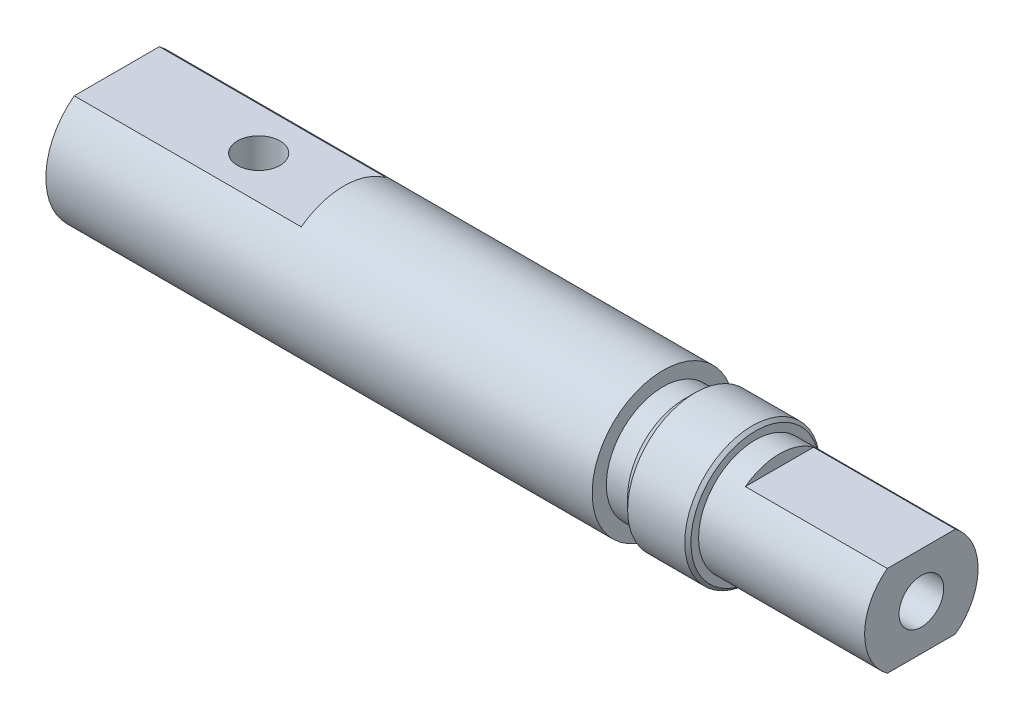
ISO-10303-21;
HEADER;
FILE_DESCRIPTION(('STEP AP214'),'2;1');
FILE_NAME('part.step','',(''),(''),'','','');
FILE_SCHEMA(('AUTOMOTIVE_DESIGN { 1 0 10303 214 1 1 1 1 }'));
ENDSEC;
DATA;
#1=APPLICATION_CONTEXT('core data for automotive mechanical design processes');
#2=APPLICATION_PROTOCOL_DEFINITION('international standard','automotive_design',2000,#1);
#3=PRODUCT_CONTEXT('',#1,'mechanical');
#4=PRODUCT('Part','Part','',(#3));
#5=PRODUCT_RELATED_PRODUCT_CATEGORY('part','',(#4));
#6=PRODUCT_DEFINITION_FORMATION('','',#4);
#7=PRODUCT_DEFINITION_CONTEXT('part definition',#1,'design');
#8=PRODUCT_DEFINITION('design','',#6,#7);
#9=PRODUCT_DEFINITION_SHAPE('','',#8);
#10=(LENGTH_UNIT() NAMED_UNIT(*) SI_UNIT(.MILLI.,.METRE.));
#11=(NAMED_UNIT(*) PLANE_ANGLE_UNIT() SI_UNIT($,.RADIAN.));
#12=(NAMED_UNIT(*) SI_UNIT($,.STERADIAN.) SOLID_ANGLE_UNIT());
#13=UNCERTAINTY_MEASURE_WITH_UNIT(LENGTH_MEASURE(1.E-05),#10,'distance_accuracy_value','');
#14=(GEOMETRIC_REPRESENTATION_CONTEXT(3) GLOBAL_UNCERTAINTY_ASSIGNED_CONTEXT((#13)) GLOBAL_UNIT_ASSIGNED_CONTEXT((#10,
#11,#12)) REPRESENTATION_CONTEXT('',''));
#15=CARTESIAN_POINT('',(0.,0.,0.));
#16=DIRECTION('',(0.,0.,1.));
#17=DIRECTION('',(1.,0.,0.));
#18=AXIS2_PLACEMENT_3D('',#15,#16,#17);
#19=CARTESIAN_POINT('',(45.,0.,0.));
#20=DIRECTION('',(-1.,0.,0.));
#21=DIRECTION('',(0.,0.,1.));
#22=AXIS2_PLACEMENT_3D('',#19,#20,#21);
#23=CYLINDRICAL_SURFACE('',#22,4.7565);
#24=CARTESIAN_POINT('',(44.7835,0.,0.));
#25=DIRECTION('',(-1.,0.,0.));
#26=DIRECTION('',(0.,0.,1.));
#27=AXIS2_PLACEMENT_3D('',#24,#25,#26);
#28=CIRCLE('',#27,4.7565);
#29=CARTESIAN_POINT('',(44.7835,0.,4.7565));
#30=VERTEX_POINT('',#29);
#31=EDGE_CURVE('E496',#30,#30,#28,.T.);
#32=ORIENTED_EDGE('',*,*,#31,.T.);
#33=EDGE_LOOP('',(#32));
#34=FACE_BOUND('',#33,.T.);
#35=CARTESIAN_POINT('',(40.7565,0.,0.));
#36=DIRECTION('',(1.,0.,0.));
#37=DIRECTION('',(0.,0.,-1.));
#38=AXIS2_PLACEMENT_3D('',#35,#36,#37);
#39=CIRCLE('',#38,4.7565);
#40=CARTESIAN_POINT('',(40.7565,0.,-4.7565));
#41=VERTEX_POINT('',#40);
#42=EDGE_CURVE('E494',#41,#41,#39,.F.);
#43=ORIENTED_EDGE('',*,*,#42,.F.);
#44=EDGE_LOOP('',(#43));
#45=FACE_BOUND('',#44,.T.);
#46=ADVANCED_FACE('F55',(#34,#45),#23,.T.);
#47=CARTESIAN_POINT('',(45.,0.,0.));
#48=DIRECTION('',(-1.,0.,0.));
#49=DIRECTION('',(0.,0.,1.));
#50=AXIS2_PLACEMENT_3D('',#47,#48,#49);
#51=CONICAL_SURFACE('',#50,4.54,0.78539816339745);
#52=ORIENTED_EDGE('',*,*,#31,.F.);
#53=EDGE_LOOP('',(#52));
#54=FACE_BOUND('',#53,.T.);
#55=CARTESIAN_POINT('',(45.,0.,0.));
#56=DIRECTION('',(-1.,0.,0.));
#57=DIRECTION('',(0.,0.,1.));
#58=AXIS2_PLACEMENT_3D('',#55,#56,#57);
#59=CIRCLE('',#58,4.54);
#60=CARTESIAN_POINT('',(45.,0.,4.54));
#61=VERTEX_POINT('',#60);
#62=EDGE_CURVE('E162',#61,#61,#59,.T.);
#63=ORIENTED_EDGE('',*,*,#62,.T.);
#64=EDGE_LOOP('',(#63));
#65=FACE_BOUND('',#64,.T.);
#66=ADVANCED_FACE('F275',(#54,#65),#51,.T.);
#67=CARTESIAN_POINT('',(46.7,0.,0.));
#68=DIRECTION('',(1.,0.,0.));
#69=DIRECTION('',(0.,0.,-1.));
#70=AXIS2_PLACEMENT_3D('',#67,#68,#69);
#71=CONICAL_SURFACE('',#70,1.575,1.02974425867665);
#72=CARTESIAN_POINT('',(45.7536445250316,0.,0.));
#73=VERTEX_POINT('',#72);
#74=VERTEX_LOOP('',#73);
#75=FACE_BOUND('',#74,.T.);
#76=CARTESIAN_POINT('',(46.7,0.,0.));
#77=DIRECTION('',(1.,0.,0.));
#78=DIRECTION('',(0.,0.,-1.));
#79=AXIS2_PLACEMENT_3D('',#76,#77,#78);
#80=CIRCLE('',#79,1.575);
#81=CARTESIAN_POINT('',(46.7,0.,-1.575));
#82=VERTEX_POINT('',#81);
#83=EDGE_CURVE('E170',#82,#82,#80,.T.);
#84=ORIENTED_EDGE('',*,*,#83,.T.);
#85=EDGE_LOOP('',(#84));
#86=FACE_BOUND('',#85,.T.);
#87=ADVANCED_FACE('F282',(#75,#86),#71,.F.);
#88=CARTESIAN_POINT('',(56.7,0.,0.));
#89=DIRECTION('',(1.,0.,0.));
#90=DIRECTION('',(0.,0.,-1.));
#91=AXIS2_PLACEMENT_3D('',#88,#89,#90);
#92=CYLINDRICAL_SURFACE('',#91,1.575);
#93=ORIENTED_EDGE('',*,*,#83,.F.);
#94=EDGE_LOOP('',(#93));
#95=FACE_BOUND('',#94,.T.);
#96=CARTESIAN_POINT('',(56.7,0.,0.));
#97=DIRECTION('',(1.,0.,0.));
#98=DIRECTION('',(0.,0.,-1.));
#99=AXIS2_PLACEMENT_3D('',#96,#97,#98);
#100=CIRCLE('',#99,1.575);
#101=CARTESIAN_POINT('',(56.7,0.,-1.575));
#102=VERTEX_POINT('',#101);
#103=EDGE_CURVE('E147',#102,#102,#100,.T.);
#104=ORIENTED_EDGE('',*,*,#103,.T.);
#105=EDGE_LOOP('',(#104));
#106=FACE_BOUND('',#105,.T.);
#107=ADVANCED_FACE('F299',(#95,#106),#92,.F.);
#108=CARTESIAN_POINT('',(46.7,0.,0.));
#109=DIRECTION('',(1.,0.,0.));
#110=DIRECTION('',(0.,0.,-1.));
#111=AXIS2_PLACEMENT_3D('',#108,#109,#110);
#112=PLANE('',#111);
#113=DIRECTION('',(0.,0.,-1.));
#114=VECTOR('',#113,1.);
#115=CARTESIAN_POINT('',(46.7,-3.2,0.));
#116=LINE('',#115,#114);
#117=CARTESIAN_POINT('',(46.7,-3.2,2.4));
#118=VERTEX_POINT('',#117);
#119=CARTESIAN_POINT('',(46.7,-3.2,-2.4));
#120=VERTEX_POINT('',#119);
#121=EDGE_CURVE('E151',#118,#120,#116,.T.);
#122=ORIENTED_EDGE('',*,*,#121,.F.);
#123=CARTESIAN_POINT('',(46.7,0.,0.));
#124=DIRECTION('',(1.,0.,0.));
#125=DIRECTION('',(0.,0.,-1.));
#126=AXIS2_PLACEMENT_3D('',#123,#124,#125);
#127=CIRCLE('',#126,4.);
#128=EDGE_CURVE('E154',#118,#120,#127,.T.);
#129=ORIENTED_EDGE('',*,*,#128,.T.);
#130=EDGE_LOOP('',(#122,#129));
#131=FACE_BOUND('',#130,.T.);
#132=ADVANCED_FACE('F296',(#131),#112,.T.);
#133=CARTESIAN_POINT('',(46.7,-3.2,0.));
#134=DIRECTION('',(0.,-1.,0.));
#135=DIRECTION('',(0.,0.,-1.));
#136=AXIS2_PLACEMENT_3D('',#133,#134,#135);
#137=PLANE('',#136);
#138=DIRECTION('',(0.,0.,-1.));
#139=VECTOR('',#138,1.);
#140=CARTESIAN_POINT('',(56.7,-3.2,0.));
#141=LINE('',#140,#139);
#142=CARTESIAN_POINT('',(56.7,-3.2,2.4));
#143=VERTEX_POINT('',#142);
#144=CARTESIAN_POINT('',(56.7,-3.2,-2.4));
#145=VERTEX_POINT('',#144);
#146=EDGE_CURVE('E155',#143,#145,#141,.T.);
#147=ORIENTED_EDGE('',*,*,#146,.F.);
#148=DIRECTION('',(1.,0.,0.));
#149=VECTOR('',#148,1.);
#150=CARTESIAN_POINT('',(46.7,-3.2,2.4));
#151=LINE('',#150,#149);
#152=EDGE_CURVE('E159',#118,#143,#151,.T.);
#153=ORIENTED_EDGE('',*,*,#152,.F.);
#154=ORIENTED_EDGE('',*,*,#121,.T.);
#155=DIRECTION('',(1.,0.,0.));
#156=VECTOR('',#155,1.);
#157=CARTESIAN_POINT('',(46.7,-3.2,-2.4));
#158=LINE('',#157,#156);
#159=EDGE_CURVE('E72',#120,#145,#158,.T.);
#160=ORIENTED_EDGE('',*,*,#159,.T.);
#161=EDGE_LOOP('',(#147,#153,#154,#160));
#162=FACE_BOUND('',#161,.T.);
#163=ADVANCED_FACE('F292',(#162),#137,.T.);
#164=CARTESIAN_POINT('',(46.7,0.,0.));
#165=DIRECTION('',(1.,0.,0.));
#166=DIRECTION('',(0.,0.,-1.));
#167=AXIS2_PLACEMENT_3D('',#164,#165,#166);
#168=PLANE('',#167);
#169=CARTESIAN_POINT('',(46.7,0.,0.));
#170=DIRECTION('',(1.,0.,0.));
#171=DIRECTION('',(0.,0.,-1.));
#172=AXIS2_PLACEMENT_3D('',#169,#170,#171);
#173=CIRCLE('',#172,4.);
#174=CARTESIAN_POINT('',(46.7,3.2,-2.4));
#175=VERTEX_POINT('',#174);
#176=CARTESIAN_POINT('',(46.7,3.2,2.4));
#177=VERTEX_POINT('',#176);
#178=EDGE_CURVE('E126',#175,#177,#173,.T.);
#179=ORIENTED_EDGE('',*,*,#178,.T.);
#180=DIRECTION('',(0.,0.,-1.));
#181=VECTOR('',#180,1.);
#182=CARTESIAN_POINT('',(46.7,3.2,0.));
#183=LINE('',#182,#181);
#184=EDGE_CURVE('E128',#177,#175,#183,.T.);
#185=ORIENTED_EDGE('',*,*,#184,.T.);
#186=EDGE_LOOP('',(#179,#185));
#187=FACE_BOUND('',#186,.T.);
#188=ADVANCED_FACE('F127',(#187),#168,.T.);
#189=CARTESIAN_POINT('',(46.7,3.2,0.));
#190=DIRECTION('',(0.,-1.,0.));
#191=DIRECTION('',(0.,0.,-1.));
#192=AXIS2_PLACEMENT_3D('',#189,#190,#191);
#193=PLANE('',#192);
#194=DIRECTION('',(0.,0.,-1.));
#195=VECTOR('',#194,1.);
#196=CARTESIAN_POINT('',(56.7,3.2,0.));
#197=LINE('',#196,#195);
#198=CARTESIAN_POINT('',(56.7,3.2,2.4));
#199=VERTEX_POINT('',#198);
#200=CARTESIAN_POINT('',(56.7,3.2,-2.4));
#201=VERTEX_POINT('',#200);
#202=EDGE_CURVE('E132',#199,#201,#197,.T.);
#203=ORIENTED_EDGE('',*,*,#202,.T.);
#204=DIRECTION('',(1.,0.,0.));
#205=VECTOR('',#204,1.);
#206=CARTESIAN_POINT('',(46.7,3.2,-2.4));
#207=LINE('',#206,#205);
#208=EDGE_CURVE('E135',#175,#201,#207,.T.);
#209=ORIENTED_EDGE('',*,*,#208,.F.);
#210=ORIENTED_EDGE('',*,*,#184,.F.);
#211=DIRECTION('',(1.,0.,0.));
#212=VECTOR('',#211,1.);
#213=CARTESIAN_POINT('',(46.7,3.2,2.4));
#214=LINE('',#213,#212);
#215=EDGE_CURVE('E80',#177,#199,#214,.T.);
#216=ORIENTED_EDGE('',*,*,#215,.T.);
#217=EDGE_LOOP('',(#203,#209,#210,#216));
#218=FACE_BOUND('',#217,.T.);
#219=ADVANCED_FACE('F134',(#218),#193,.F.);
#220=CARTESIAN_POINT('',(56.7,0.,0.));
#221=DIRECTION('',(1.,0.,0.));
#222=DIRECTION('',(0.,0.,-1.));
#223=AXIS2_PLACEMENT_3D('',#220,#221,#222);
#224=PLANE('',#223);
#225=ORIENTED_EDGE('',*,*,#202,.F.);
#226=CARTESIAN_POINT('',(56.7,0.,0.));
#227=DIRECTION('',(1.,0.,0.));
#228=DIRECTION('',(0.,0.,-1.));
#229=AXIS2_PLACEMENT_3D('',#226,#227,#228);
#230=CIRCLE('',#229,4.);
#231=EDGE_CURVE('E143',#199,#143,#230,.T.);
#232=ORIENTED_EDGE('',*,*,#231,.T.);
#233=ORIENTED_EDGE('',*,*,#146,.T.);
#234=EDGE_CURVE('E174',#145,#201,#230,.T.);
#235=ORIENTED_EDGE('',*,*,#234,.T.);
#236=EDGE_LOOP('',(#225,#232,#233,#235));
#237=FACE_BOUND('',#236,.T.);
#238=ORIENTED_EDGE('',*,*,#103,.F.);
#239=EDGE_LOOP('',(#238));
#240=FACE_BOUND('',#239,.T.);
#241=ADVANCED_FACE('F295',(#237,#240),#224,.T.);
#242=CARTESIAN_POINT('',(0.,0.,0.));
#243=DIRECTION('',(-1.,0.,0.));
#244=DIRECTION('',(0.,0.,1.));
#245=AXIS2_PLACEMENT_3D('',#242,#243,#244);
#246=CYLINDRICAL_SURFACE('',#245,4.);
#247=ORIENTED_EDGE('',*,*,#231,.F.);
#248=ORIENTED_EDGE('',*,*,#215,.F.);
#249=ORIENTED_EDGE('',*,*,#178,.F.);
#250=ORIENTED_EDGE('',*,*,#208,.T.);
#251=ORIENTED_EDGE('',*,*,#234,.F.);
#252=ORIENTED_EDGE('',*,*,#159,.F.);
#253=ORIENTED_EDGE('',*,*,#128,.F.);
#254=ORIENTED_EDGE('',*,*,#152,.T.);
#255=EDGE_LOOP('',(#247,#248,#249,#250,#251,#252,#253,#254));
#256=FACE_BOUND('',#255,.T.);
#257=CARTESIAN_POINT('',(45.,0.,0.));
#258=DIRECTION('',(-1.,0.,0.));
#259=DIRECTION('',(0.,0.,1.));
#260=AXIS2_PLACEMENT_3D('',#257,#258,#259);
#261=CIRCLE('',#260,4.);
#262=CARTESIAN_POINT('',(45.,0.,4.));
#263=VERTEX_POINT('',#262);
#264=EDGE_CURVE('E215',#263,#263,#261,.T.);
#265=ORIENTED_EDGE('',*,*,#264,.F.);
#266=EDGE_LOOP('',(#265));
#267=FACE_BOUND('',#266,.T.);
#268=ADVANCED_FACE('F139',(#256,#267),#246,.T.);
#269=CARTESIAN_POINT('',(45.,0.,0.));
#270=DIRECTION('',(1.,0.,0.));
#271=DIRECTION('',(0.,0.,-1.));
#272=AXIS2_PLACEMENT_3D('',#269,#270,#271);
#273=PLANE('',#272);
#274=ORIENTED_EDGE('',*,*,#264,.T.);
#275=EDGE_LOOP('',(#274));
#276=FACE_BOUND('',#275,.T.);
#277=ORIENTED_EDGE('',*,*,#62,.F.);
#278=EDGE_LOOP('',(#277));
#279=FACE_BOUND('',#278,.T.);
#280=ADVANCED_FACE('F270',(#276,#279),#273,.T.);
#281=CARTESIAN_POINT('',(10.,4.,0.));
#282=DIRECTION('',(0.,1.,0.));
#283=DIRECTION('',(0.,0.,1.));
#284=AXIS2_PLACEMENT_3D('',#281,#282,#283);
#285=CYLINDRICAL_SURFACE('',#284,1.5);
#286=CARTESIAN_POINT('',(10.,-4.,0.));
#287=DIRECTION('',(0.,-1.,0.));
#288=DIRECTION('',(0.,0.,-1.));
#289=AXIS2_PLACEMENT_3D('',#286,#287,#288);
#290=CIRCLE('',#289,1.5);
#291=CARTESIAN_POINT('',(10.,-4.,-1.5));
#292=VERTEX_POINT('',#291);
#293=EDGE_CURVE('E194',#292,#292,#290,.T.);
#294=ORIENTED_EDGE('',*,*,#293,.T.);
#295=EDGE_LOOP('',(#294));
#296=FACE_BOUND('',#295,.T.);
#297=CARTESIAN_POINT('',(10.,4.,0.));
#298=DIRECTION('',(0.,1.,0.));
#299=DIRECTION('',(0.,0.,1.));
#300=AXIS2_PLACEMENT_3D('',#297,#298,#299);
#301=CIRCLE('',#300,1.5);
#302=CARTESIAN_POINT('',(10.,4.,1.5));
#303=VERTEX_POINT('',#302);
#304=EDGE_CURVE('E190',#303,#303,#301,.T.);
#305=ORIENTED_EDGE('',*,*,#304,.T.);
#306=EDGE_LOOP('',(#305));
#307=FACE_BOUND('',#306,.T.);
#308=ADVANCED_FACE('F260',(#296,#307),#285,.F.);
#309=CARTESIAN_POINT('',(16.,0.,0.));
#310=DIRECTION('',(-1.,0.,0.));
#311=DIRECTION('',(0.,0.,1.));
#312=AXIS2_PLACEMENT_3D('',#309,#310,#311);
#313=PLANE('',#312);
#314=DIRECTION('',(0.,0.,1.));
#315=VECTOR('',#314,1.);
#316=CARTESIAN_POINT('',(16.,-4.,0.));
#317=LINE('',#316,#315);
#318=CARTESIAN_POINT('',(16.,-4.,-3.));
#319=VERTEX_POINT('',#318);
#320=CARTESIAN_POINT('',(16.,-4.,3.));
#321=VERTEX_POINT('',#320);
#322=EDGE_CURVE('E219',#319,#321,#317,.T.);
#323=ORIENTED_EDGE('',*,*,#322,.F.);
#324=CARTESIAN_POINT('',(16.,0.,0.));
#325=DIRECTION('',(-1.,0.,0.));
#326=DIRECTION('',(0.,0.,1.));
#327=AXIS2_PLACEMENT_3D('',#324,#325,#326);
#328=CIRCLE('',#327,5.);
#329=EDGE_CURVE('E222',#319,#321,#328,.T.);
#330=ORIENTED_EDGE('',*,*,#329,.T.);
#331=EDGE_LOOP('',(#323,#330));
#332=FACE_BOUND('',#331,.T.);
#333=ADVANCED_FACE('F258',(#332),#313,.T.);
#334=CARTESIAN_POINT('',(16.,-4.,0.));
#335=DIRECTION('',(0.,-1.,0.));
#336=DIRECTION('',(0.,0.,-1.));
#337=AXIS2_PLACEMENT_3D('',#334,#335,#336);
#338=PLANE('',#337);
#339=ORIENTED_EDGE('',*,*,#293,.F.);
#340=EDGE_LOOP('',(#339));
#341=FACE_BOUND('',#340,.T.);
#342=DIRECTION('',(0.,0.,1.));
#343=VECTOR('',#342,1.);
#344=CARTESIAN_POINT('',(0.,-4.,0.));
#345=LINE('',#344,#343);
#346=CARTESIAN_POINT('',(0.,-4.,-3.));
#347=VERTEX_POINT('',#346);
#348=CARTESIAN_POINT('',(0.,-4.,3.));
#349=VERTEX_POINT('',#348);
#350=EDGE_CURVE('E198',#347,#349,#345,.T.);
#351=ORIENTED_EDGE('',*,*,#350,.F.);
#352=DIRECTION('',(-1.,0.,0.));
#353=VECTOR('',#352,1.);
#354=CARTESIAN_POINT('',(16.,-4.,-3.));
#355=LINE('',#354,#353);
#356=EDGE_CURVE('E226',#319,#347,#355,.T.);
#357=ORIENTED_EDGE('',*,*,#356,.F.);
#358=ORIENTED_EDGE('',*,*,#322,.T.);
#359=DIRECTION('',(-1.,0.,0.));
#360=VECTOR('',#359,1.);
#361=CARTESIAN_POINT('',(16.,-4.,3.));
#362=LINE('',#361,#360);
#363=EDGE_CURVE('E211',#321,#349,#362,.T.);
#364=ORIENTED_EDGE('',*,*,#363,.T.);
#365=EDGE_LOOP('',(#351,#357,#358,#364));
#366=FACE_BOUND('',#365,.T.);
#367=ADVANCED_FACE('F256',(#341,#366),#338,.T.);
#368=CARTESIAN_POINT('',(0.,0.,0.));
#369=DIRECTION('',(1.,0.,0.));
#370=DIRECTION('',(0.,0.,-1.));
#371=AXIS2_PLACEMENT_3D('',#368,#369,#370);
#372=PLANE('',#371);
#373=DIRECTION('',(0.,0.,-1.));
#374=VECTOR('',#373,1.);
#375=CARTESIAN_POINT('',(0.,4.,0.));
#376=LINE('',#375,#374);
#377=CARTESIAN_POINT('',(0.,4.,3.));
#378=VERTEX_POINT('',#377);
#379=CARTESIAN_POINT('',(0.,4.,-3.));
#380=VERTEX_POINT('',#379);
#381=EDGE_CURVE('E203',#378,#380,#376,.T.);
#382=ORIENTED_EDGE('',*,*,#381,.T.);
#383=CARTESIAN_POINT('',(0.,0.,0.));
#384=DIRECTION('',(-1.,0.,0.));
#385=DIRECTION('',(0.,0.,1.));
#386=AXIS2_PLACEMENT_3D('',#383,#384,#385);
#387=CIRCLE('',#386,5.);
#388=EDGE_CURVE('E11',#380,#347,#387,.T.);
#389=ORIENTED_EDGE('',*,*,#388,.T.);
#390=ORIENTED_EDGE('',*,*,#350,.T.);
#391=EDGE_CURVE('E60',#349,#378,#387,.T.);
#392=ORIENTED_EDGE('',*,*,#391,.T.);
#393=EDGE_LOOP('',(#382,#389,#390,#392));
#394=FACE_BOUND('',#393,.T.);
#395=ADVANCED_FACE('F242',(#394),#372,.F.);
#396=CARTESIAN_POINT('',(16.,0.,0.));
#397=DIRECTION('',(-1.,0.,0.));
#398=DIRECTION('',(0.,0.,1.));
#399=AXIS2_PLACEMENT_3D('',#396,#397,#398);
#400=PLANE('',#399);
#401=DIRECTION('',(0.,0.,-1.));
#402=VECTOR('',#401,1.);
#403=CARTESIAN_POINT('',(16.,4.,0.));
#404=LINE('',#403,#402);
#405=CARTESIAN_POINT('',(16.,4.,3.));
#406=VERTEX_POINT('',#405);
#407=CARTESIAN_POINT('',(16.,4.,-3.));
#408=VERTEX_POINT('',#407);
#409=EDGE_CURVE('E199',#406,#408,#404,.T.);
#410=ORIENTED_EDGE('',*,*,#409,.F.);
#411=CARTESIAN_POINT('',(16.,0.,0.));
#412=DIRECTION('',(-1.,0.,0.));
#413=DIRECTION('',(0.,0.,1.));
#414=AXIS2_PLACEMENT_3D('',#411,#412,#413);
#415=CIRCLE('',#414,5.);
#416=EDGE_CURVE('E202',#406,#408,#415,.T.);
#417=ORIENTED_EDGE('',*,*,#416,.T.);
#418=EDGE_LOOP('',(#410,#417));
#419=FACE_BOUND('',#418,.T.);
#420=ADVANCED_FACE('F320',(#419),#400,.T.);
#421=CARTESIAN_POINT('',(16.,4.,0.));
#422=DIRECTION('',(0.,1.,0.));
#423=DIRECTION('',(0.,0.,1.));
#424=AXIS2_PLACEMENT_3D('',#421,#422,#423);
#425=PLANE('',#424);
#426=ORIENTED_EDGE('',*,*,#304,.F.);
#427=EDGE_LOOP('',(#426));
#428=FACE_BOUND('',#427,.T.);
#429=ORIENTED_EDGE('',*,*,#381,.F.);
#430=DIRECTION('',(-1.,0.,0.));
#431=VECTOR('',#430,1.);
#432=CARTESIAN_POINT('',(16.,4.,3.));
#433=LINE('',#432,#431);
#434=EDGE_CURVE('E207',#406,#378,#433,.T.);
#435=ORIENTED_EDGE('',*,*,#434,.F.);
#436=ORIENTED_EDGE('',*,*,#409,.T.);
#437=DIRECTION('',(-1.,0.,0.));
#438=VECTOR('',#437,1.);
#439=CARTESIAN_POINT('',(16.,4.,-3.));
#440=LINE('',#439,#438);
#441=EDGE_CURVE('E212',#408,#380,#440,.T.);
#442=ORIENTED_EDGE('',*,*,#441,.T.);
#443=EDGE_LOOP('',(#429,#435,#436,#442));
#444=FACE_BOUND('',#443,.T.);
#445=ADVANCED_FACE('F253',(#428,#444),#425,.T.);
#446=CARTESIAN_POINT('',(0.,0.,0.));
#447=DIRECTION('',(-1.,0.,0.));
#448=DIRECTION('',(0.,0.,1.));
#449=AXIS2_PLACEMENT_3D('',#446,#447,#448);
#450=CYLINDRICAL_SURFACE('',#449,5.);
#451=ORIENTED_EDGE('',*,*,#441,.F.);
#452=ORIENTED_EDGE('',*,*,#416,.F.);
#453=ORIENTED_EDGE('',*,*,#434,.T.);
#454=ORIENTED_EDGE('',*,*,#391,.F.);
#455=ORIENTED_EDGE('',*,*,#363,.F.);
#456=ORIENTED_EDGE('',*,*,#329,.F.);
#457=ORIENTED_EDGE('',*,*,#356,.T.);
#458=ORIENTED_EDGE('',*,*,#388,.F.);
#459=EDGE_LOOP('',(#451,#452,#453,#454,#455,#456,#457,#458));
#460=FACE_BOUND('',#459,.T.);
#461=CARTESIAN_POINT('',(38.5,0.,0.));
#462=DIRECTION('',(1.,0.,0.));
#463=DIRECTION('',(0.,0.,-1.));
#464=AXIS2_PLACEMENT_3D('',#461,#462,#463);
#465=CIRCLE('',#464,5.);
#466=CARTESIAN_POINT('',(38.5,0.,-5.));
#467=VERTEX_POINT('',#466);
#468=EDGE_CURVE('E182',#467,#467,#465,.T.);
#469=ORIENTED_EDGE('',*,*,#468,.F.);
#470=EDGE_LOOP('',(#469));
#471=FACE_BOUND('',#470,.T.);
#472=ADVANCED_FACE('F247',(#460,#471),#450,.T.);
#473=CARTESIAN_POINT('',(38.5,0.,0.));
#474=DIRECTION('',(1.,0.,0.));
#475=DIRECTION('',(0.,0.,-1.));
#476=AXIS2_PLACEMENT_3D('',#473,#474,#475);
#477=PLANE('',#476);
#478=CARTESIAN_POINT('',(38.5,0.,0.));
#479=DIRECTION('',(1.,0.,0.));
#480=DIRECTION('',(0.,0.,-1.));
#481=AXIS2_PLACEMENT_3D('',#478,#479,#480);
#482=CIRCLE('',#481,4.);
#483=CARTESIAN_POINT('',(38.5,0.,-4.));
#484=VERTEX_POINT('',#483);
#485=EDGE_CURVE('E178',#484,#484,#482,.T.);
#486=ORIENTED_EDGE('',*,*,#485,.F.);
#487=EDGE_LOOP('',(#486));
#488=FACE_BOUND('',#487,.T.);
#489=ORIENTED_EDGE('',*,*,#468,.T.);
#490=EDGE_LOOP('',(#489));
#491=FACE_BOUND('',#490,.T.);
#492=ADVANCED_FACE('F315',(#488,#491),#477,.T.);
#493=CARTESIAN_POINT('',(38.5,0.,0.));
#494=DIRECTION('',(1.,0.,0.));
#495=DIRECTION('',(0.,0.,-1.));
#496=AXIS2_PLACEMENT_3D('',#493,#494,#495);
#497=CYLINDRICAL_SURFACE('',#496,4.);
#498=ORIENTED_EDGE('',*,*,#485,.T.);
#499=EDGE_LOOP('',(#498));
#500=FACE_BOUND('',#499,.T.);
#501=CARTESIAN_POINT('',(40.,0.,0.));
#502=DIRECTION('',(1.,0.,0.));
#503=DIRECTION('',(0.,0.,-1.));
#504=AXIS2_PLACEMENT_3D('',#501,#502,#503);
#505=CIRCLE('',#504,4.);
#506=CARTESIAN_POINT('',(40.,0.,-4.));
#507=VERTEX_POINT('',#506);
#508=EDGE_CURVE('E183',#507,#507,#505,.T.);
#509=ORIENTED_EDGE('',*,*,#508,.F.);
#510=EDGE_LOOP('',(#509));
#511=FACE_BOUND('',#510,.T.);
#512=ADVANCED_FACE('F312',(#500,#511),#497,.T.);
#513=CARTESIAN_POINT('',(41.,0.,0.));
#514=DIRECTION('',(1.,0.,0.));
#515=DIRECTION('',(0.,0.,-1.));
#516=AXIS2_PLACEMENT_3D('',#513,#514,#515);
#517=CONICAL_SURFACE('',#516,5.,0.785398163397453);
#518=ORIENTED_EDGE('',*,*,#508,.T.);
#519=EDGE_LOOP('',(#518));
#520=FACE_BOUND('',#519,.T.);
#521=ORIENTED_EDGE('',*,*,#42,.T.);
#522=EDGE_LOOP('',(#521));
#523=FACE_BOUND('',#522,.T.);
#524=ADVANCED_FACE('F58',(#520,#523),#517,.T.);
#525=CLOSED_SHELL('',(#46,#66,#87,#107,#132,#163,#188,#219,#241,#268,#280,#308,#333,#367,#395,
#420,#445,#472,#492,#512,#524));
#526=MANIFOLD_SOLID_BREP('B2',#525);
#527=ADVANCED_BREP_SHAPE_REPRESENTATION('',(#18,#526),#14);
#528=SHAPE_DEFINITION_REPRESENTATION(#9,#527);
ENDSEC;
END-ISO-10303-21;
